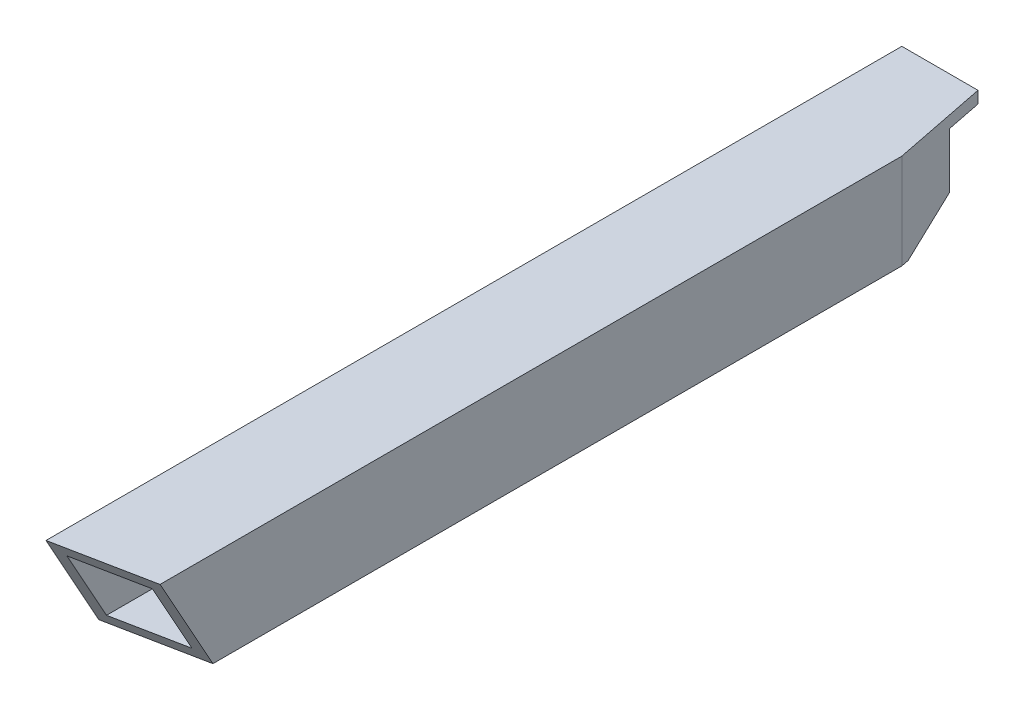
ISO-10303-21;
HEADER;
FILE_DESCRIPTION(('STEP AP214'),'2;1');
FILE_NAME('part.step','',(''),(''),'','','');
FILE_SCHEMA(('AUTOMOTIVE_DESIGN { 1 0 10303 214 1 1 1 1 }'));
ENDSEC;
DATA;
#1=APPLICATION_CONTEXT('core data for automotive mechanical design processes');
#2=APPLICATION_PROTOCOL_DEFINITION('international standard','automotive_design',2000,#1);
#3=PRODUCT_CONTEXT('',#1,'mechanical');
#4=PRODUCT('Part','Part','',(#3));
#5=PRODUCT_RELATED_PRODUCT_CATEGORY('part','',(#4));
#6=PRODUCT_DEFINITION_FORMATION('','',#4);
#7=PRODUCT_DEFINITION_CONTEXT('part definition',#1,'design');
#8=PRODUCT_DEFINITION('design','',#6,#7);
#9=PRODUCT_DEFINITION_SHAPE('','',#8);
#10=(LENGTH_UNIT() NAMED_UNIT(*) SI_UNIT(.MILLI.,.METRE.));
#11=(NAMED_UNIT(*) PLANE_ANGLE_UNIT() SI_UNIT($,.RADIAN.));
#12=(NAMED_UNIT(*) SI_UNIT($,.STERADIAN.) SOLID_ANGLE_UNIT());
#13=UNCERTAINTY_MEASURE_WITH_UNIT(LENGTH_MEASURE(1.E-05),#10,'distance_accuracy_value','');
#14=(GEOMETRIC_REPRESENTATION_CONTEXT(3) GLOBAL_UNCERTAINTY_ASSIGNED_CONTEXT((#13)) GLOBAL_UNIT_ASSIGNED_CONTEXT((#10,
#11,#12)) REPRESENTATION_CONTEXT('',''));
#15=CARTESIAN_POINT('',(0.,0.,0.));
#16=DIRECTION('',(0.,0.,1.));
#17=DIRECTION('',(1.,0.,0.));
#18=AXIS2_PLACEMENT_3D('',#15,#16,#17);
#19=CARTESIAN_POINT('',(12.7,-12.7,114.3));
#20=DIRECTION('',(0.,1.,0.));
#21=DIRECTION('',(0.,0.,1.));
#22=AXIS2_PLACEMENT_3D('',#19,#20,#21);
#23=PLANE('',#22);
#24=DIRECTION('',(-0.999378196944264,0.,-0.0352593175264528));
#25=VECTOR('',#24,1.);
#26=CARTESIAN_POINT('',(19.9342979692048,-12.7,-90.746500267549));
#27=LINE('',#26,#25);
#28=CARTESIAN_POINT('',(12.2785974410021,-12.7,-91.016602994061));
#29=VERTEX_POINT('',#28);
#30=CARTESIAN_POINT('',(-12.7,-12.7,-91.8978792728819));
#31=VERTEX_POINT('',#30);
#32=EDGE_CURVE('E122',#29,#31,#27,.T.);
#33=ORIENTED_EDGE('',*,*,#32,.F.);
#34=DIRECTION('',(-0.195261498367845,0.,-0.98075121578061));
#35=VECTOR('',#34,1.);
#36=CARTESIAN_POINT('',(51.6133998300237,-12.7,106.552582882245));
#37=LINE('',#36,#35);
#38=CARTESIAN_POINT('',(12.7,-12.7,-88.9));
#39=VERTEX_POINT('',#38);
#40=EDGE_CURVE('E62',#39,#29,#37,.T.);
#41=ORIENTED_EDGE('',*,*,#40,.F.);
#42=DIRECTION('',(0.,0.,-1.));
#43=VECTOR('',#42,1.);
#44=CARTESIAN_POINT('',(12.7,-12.7,114.3));
#45=LINE('',#44,#43);
#46=CARTESIAN_POINT('',(12.7,-12.7,95.1168240755557));
#47=VERTEX_POINT('',#46);
#48=EDGE_CURVE('E191',#47,#39,#45,.T.);
#49=ORIENTED_EDGE('',*,*,#48,.F.);
#50=DIRECTION('',(0.98075121578061,0.,-0.195261498367845));
#51=VECTOR('',#50,1.);
#52=CARTESIAN_POINT('',(9.0263651832796,-12.7,95.8482220358408));
#53=LINE('',#52,#51);
#54=CARTESIAN_POINT('',(-12.7,-12.7,100.173806905392));
#55=VERTEX_POINT('',#54);
#56=EDGE_CURVE('E157',#55,#47,#53,.T.);
#57=ORIENTED_EDGE('',*,*,#56,.F.);
#58=DIRECTION('',(0.,0.,-1.));
#59=VECTOR('',#58,1.);
#60=CARTESIAN_POINT('',(-12.7,-12.7,114.3));
#61=LINE('',#60,#59);
#62=EDGE_CURVE('E129',#55,#31,#61,.T.);
#63=ORIENTED_EDGE('',*,*,#62,.T.);
#64=EDGE_LOOP('',(#33,#41,#49,#57,#63));
#65=FACE_BOUND('',#64,.T.);
#66=ADVANCED_FACE('F40',(#65),#23,.F.);
#67=CARTESIAN_POINT('',(9.525,-9.525,114.3));
#68=DIRECTION('',(0.,1.,0.));
#69=DIRECTION('',(0.,0.,1.));
#70=AXIS2_PLACEMENT_3D('',#67,#68,#69);
#71=PLANE('',#70);
#72=DIRECTION('',(0.,0.,-1.));
#73=VECTOR('',#72,1.);
#74=CARTESIAN_POINT('',(9.525,-9.525,114.3));
#75=LINE('',#74,#73);
#76=CARTESIAN_POINT('',(9.525,-9.525,97.5147210661112));
#77=VERTEX_POINT('',#76);
#78=CARTESIAN_POINT('',(9.525,-9.52499999999999,-96.9383195232982));
#79=VERTEX_POINT('',#78);
#80=EDGE_CURVE('E179',#77,#79,#75,.T.);
#81=ORIENTED_EDGE('',*,*,#80,.T.);
#82=DIRECTION('',(-0.999378196944264,0.,-0.0352593175264528));
#83=VECTOR('',#82,1.);
#84=CARTESIAN_POINT('',(16.9684877186839,-9.525,-96.6757039311432));
#85=LINE('',#84,#83);
#86=CARTESIAN_POINT('',(-9.52499999999999,-9.525,-97.6104274409341));
#87=VERTEX_POINT('',#86);
#88=EDGE_CURVE('E131',#79,#87,#85,.T.);
#89=ORIENTED_EDGE('',*,*,#88,.T.);
#90=DIRECTION('',(0.,0.,-1.));
#91=VECTOR('',#90,1.);
#92=CARTESIAN_POINT('',(-9.52499999999999,-9.525,114.3));
#93=LINE('',#92,#91);
#94=CARTESIAN_POINT('',(-9.525,-9.525,101.307458188488));
#95=VERTEX_POINT('',#94);
#96=EDGE_CURVE('E182',#95,#87,#93,.T.);
#97=ORIENTED_EDGE('',*,*,#96,.F.);
#98=DIRECTION('',(0.98075121578061,0.,-0.195261498367845));
#99=VECTOR('',#98,1.);
#100=CARTESIAN_POINT('',(6.31056953536965,-9.525,98.1546942813607));
#101=LINE('',#100,#99);
#102=EDGE_CURVE('E140',#95,#77,#101,.T.);
#103=ORIENTED_EDGE('',*,*,#102,.T.);
#104=EDGE_LOOP('',(#81,#89,#97,#103));
#105=FACE_BOUND('',#104,.T.);
#106=ADVANCED_FACE('F233',(#105),#71,.T.);
#107=CARTESIAN_POINT('',(9.525,-9.525,114.3));
#108=DIRECTION('',(-1.,0.,0.));
#109=DIRECTION('',(0.,0.,1.));
#110=AXIS2_PLACEMENT_3D('',#107,#108,#109);
#111=PLANE('',#110);
#112=DIRECTION('',(0.,-1.,0.));
#113=VECTOR('',#112,1.);
#114=CARTESIAN_POINT('',(9.525,-9.525,-104.847256044493));
#115=LINE('',#114,#113);
#116=CARTESIAN_POINT('',(9.525,9.525,-104.847256044493));
#117=VERTEX_POINT('',#116);
#118=CARTESIAN_POINT('',(9.52499999999999,-5.21379933896032,-104.847256044493));
#119=VERTEX_POINT('',#118);
#120=EDGE_CURVE('E221',#117,#119,#115,.T.);
#121=ORIENTED_EDGE('',*,*,#120,.T.);
#122=DIRECTION('',(0.,-0.478615562436227,0.878024568787146));
#123=VECTOR('',#122,1.);
#124=CARTESIAN_POINT('',(9.525,-98.2949935119247,65.9110347221163));
#125=LINE('',#124,#123);
#126=EDGE_CURVE('E55',#119,#79,#125,.T.);
#127=ORIENTED_EDGE('',*,*,#126,.T.);
#128=ORIENTED_EDGE('',*,*,#80,.F.);
#129=DIRECTION('',(0.,0.873936887721125,0.486039418442901));
#130=VECTOR('',#129,1.);
#131=CARTESIAN_POINT('',(9.525,-2.39515438657077,101.479979958633));
#132=LINE('',#131,#130);
#133=CARTESIAN_POINT('',(9.525,9.525,108.109365887067));
#134=VERTEX_POINT('',#133);
#135=EDGE_CURVE('E137',#77,#134,#132,.T.);
#136=ORIENTED_EDGE('',*,*,#135,.T.);
#137=DIRECTION('',(0.,0.,-1.));
#138=VECTOR('',#137,1.);
#139=CARTESIAN_POINT('',(9.525,9.525,114.3));
#140=LINE('',#139,#138);
#141=EDGE_CURVE('E176',#134,#117,#140,.T.);
#142=ORIENTED_EDGE('',*,*,#141,.T.);
#143=EDGE_LOOP('',(#121,#127,#128,#136,#142));
#144=FACE_BOUND('',#143,.T.);
#145=ADVANCED_FACE('F231',(#144),#111,.T.);
#146=CARTESIAN_POINT('',(0.,0.,-114.3));
#147=DIRECTION('',(0.,0.,1.));
#148=DIRECTION('',(1.,0.,0.));
#149=AXIS2_PLACEMENT_3D('',#146,#147,#148);
#150=PLANE('',#149);
#151=DIRECTION('',(0.999815116604603,0.0192284323054417,0.));
#152=VECTOR('',#151,1.);
#153=CARTESIAN_POINT('',(0.00469560413334707,-0.244155941552387,-114.3));
#154=LINE('',#153,#152);
#155=CARTESIAN_POINT('',(-12.7,-0.488492494709308,-114.3));
#156=VERTEX_POINT('',#155);
#157=CARTESIAN_POINT('',(-9.52499999999999,-0.427430932870621,-114.3));
#158=VERTEX_POINT('',#157);
#159=EDGE_CURVE('E213',#156,#158,#154,.T.);
#160=ORIENTED_EDGE('',*,*,#159,.F.);
#161=DIRECTION('',(0.,-1.,0.));
#162=VECTOR('',#161,1.);
#163=CARTESIAN_POINT('',(-12.7,-12.7,-114.3));
#164=LINE('',#163,#162);
#165=CARTESIAN_POINT('',(-12.7,12.7,-114.3));
#166=VERTEX_POINT('',#165);
#167=EDGE_CURVE('E168',#166,#156,#164,.T.);
#168=ORIENTED_EDGE('',*,*,#167,.F.);
#169=DIRECTION('',(-1.,0.,0.));
#170=VECTOR('',#169,1.);
#171=CARTESIAN_POINT('',(12.7,12.7,-114.3));
#172=LINE('',#171,#170);
#173=CARTESIAN_POINT('',(7.64301717016405,12.7,-114.3));
#174=VERTEX_POINT('',#173);
#175=EDGE_CURVE('E171',#174,#166,#172,.T.);
#176=ORIENTED_EDGE('',*,*,#175,.F.);
#177=DIRECTION('',(0.,1.,0.));
#178=VECTOR('',#177,1.);
#179=CARTESIAN_POINT('',(7.64301717016405,0.,-114.3));
#180=LINE('',#179,#178);
#181=CARTESIAN_POINT('',(7.64301717016405,9.525,-114.3));
#182=VERTEX_POINT('',#181);
#183=EDGE_CURVE('E48',#182,#174,#180,.T.);
#184=ORIENTED_EDGE('',*,*,#183,.F.);
#185=DIRECTION('',(-1.,0.,0.));
#186=VECTOR('',#185,1.);
#187=CARTESIAN_POINT('',(9.525,9.525,-114.3));
#188=LINE('',#187,#186);
#189=CARTESIAN_POINT('',(-9.52499999999999,9.525,-114.3));
#190=VERTEX_POINT('',#189);
#191=EDGE_CURVE('E166',#182,#190,#188,.T.);
#192=ORIENTED_EDGE('',*,*,#191,.T.);
#193=DIRECTION('',(0.,-1.,0.));
#194=VECTOR('',#193,1.);
#195=CARTESIAN_POINT('',(-9.52499999999999,-9.525,-114.3));
#196=LINE('',#195,#194);
#197=EDGE_CURVE('E163',#190,#158,#196,.T.);
#198=ORIENTED_EDGE('',*,*,#197,.T.);
#199=EDGE_LOOP('',(#160,#168,#176,#184,#192,#198));
#200=FACE_BOUND('',#199,.T.);
#201=ADVANCED_FACE('F203',(#200),#150,.F.);
#202=CARTESIAN_POINT('',(-12.7,-12.7,114.3));
#203=DIRECTION('',(1.,0.,0.));
#204=DIRECTION('',(0.,0.,-1.));
#205=AXIS2_PLACEMENT_3D('',#202,#203,#204);
#206=PLANE('',#205);
#207=DIRECTION('',(0.,0.478615562436227,-0.878024568787146));
#208=VECTOR('',#207,1.);
#209=CARTESIAN_POINT('',(-12.7,-99.3518179397253,67.0656627688317));
#210=LINE('',#209,#208);
#211=EDGE_CURVE('E214',#31,#156,#210,.T.);
#212=ORIENTED_EDGE('',*,*,#211,.F.);
#213=ORIENTED_EDGE('',*,*,#62,.F.);
#214=DIRECTION('',(0.,-0.873936887721125,-0.486039418442901));
#215=VECTOR('',#214,1.);
#216=CARTESIAN_POINT('',(-12.7,-6.69964836648003,103.51089847274));
#217=LINE('',#216,#215);
#218=CARTESIAN_POINT('',(-12.7,12.7,114.3));
#219=VERTEX_POINT('',#218);
#220=EDGE_CURVE('E160',#219,#55,#217,.T.);
#221=ORIENTED_EDGE('',*,*,#220,.F.);
#222=DIRECTION('',(0.,0.,-1.));
#223=VECTOR('',#222,1.);
#224=CARTESIAN_POINT('',(-12.7,12.7,114.3));
#225=LINE('',#224,#223);
#226=EDGE_CURVE('E185',#219,#166,#225,.T.);
#227=ORIENTED_EDGE('',*,*,#226,.T.);
#228=ORIENTED_EDGE('',*,*,#167,.T.);
#229=EDGE_LOOP('',(#212,#213,#221,#227,#228));
#230=FACE_BOUND('',#229,.T.);
#231=ADVANCED_FACE('F42',(#230),#206,.F.);
#232=CARTESIAN_POINT('',(-9.52499999999999,-9.525,114.3));
#233=DIRECTION('',(1.,0.,0.));
#234=DIRECTION('',(0.,0.,-1.));
#235=AXIS2_PLACEMENT_3D('',#232,#233,#234);
#236=PLANE('',#235);
#237=ORIENTED_EDGE('',*,*,#96,.T.);
#238=DIRECTION('',(0.,0.478615562436227,-0.878024568787146));
#239=VECTOR('',#238,1.);
#240=CARTESIAN_POINT('',(-9.52499999999999,-98.5774376045613,65.7570730414758));
#241=LINE('',#240,#239);
#242=EDGE_CURVE('E130',#87,#158,#241,.T.);
#243=ORIENTED_EDGE('',*,*,#242,.T.);
#244=ORIENTED_EDGE('',*,*,#197,.F.);
#245=DIRECTION('',(0.,0.,-1.));
#246=VECTOR('',#245,1.);
#247=CARTESIAN_POINT('',(-9.52499999999999,9.525,114.3));
#248=LINE('',#247,#246);
#249=CARTESIAN_POINT('',(-9.52499999999999,9.525,111.902103009444));
#250=VERTEX_POINT('',#249);
#251=EDGE_CURVE('E173',#250,#190,#248,.T.);
#252=ORIENTED_EDGE('',*,*,#251,.F.);
#253=DIRECTION('',(0.,-0.873936887721125,-0.486039418442901));
#254=VECTOR('',#253,1.);
#255=CARTESIAN_POINT('',(-9.52499999999999,-4.00618690151299,104.376742420074));
#256=LINE('',#255,#254);
#257=EDGE_CURVE('E148',#250,#95,#256,.T.);
#258=ORIENTED_EDGE('',*,*,#257,.T.);
#259=EDGE_LOOP('',(#237,#243,#244,#252,#258));
#260=FACE_BOUND('',#259,.T.);
#261=ADVANCED_FACE('F212',(#260),#236,.T.);
#262=CARTESIAN_POINT('',(29.2403988557757,0.,-5.82158247839419));
#263=DIRECTION('',(0.98075121578061,0.,-0.195261498367845));
#264=DIRECTION('',(-0.195261498367845,0.,-0.98075121578061));
#265=AXIS2_PLACEMENT_3D('',#262,#263,#264);
#266=PLANE('',#265);
#267=ORIENTED_EDGE('',*,*,#40,.T.);
#268=DIRECTION('',(-0.17246656544568,0.46888455698768,-0.86625778843358));
#269=VECTOR('',#268,1.);
#270=CARTESIAN_POINT('',(24.4842908006449,-45.8835976954391,-29.7103613541257));
#271=LINE('',#270,#269);
#272=EDGE_CURVE('E12',#29,#119,#271,.T.);
#273=ORIENTED_EDGE('',*,*,#272,.T.);
#274=ORIENTED_EDGE('',*,*,#120,.F.);
#275=DIRECTION('',(0.195261498367845,0.,0.98075121578061));
#276=VECTOR('',#275,1.);
#277=CARTESIAN_POINT('',(51.4923464375588,9.525,105.944561009901));
#278=LINE('',#277,#276);
#279=EDGE_CURVE('E199',#182,#117,#278,.T.);
#280=ORIENTED_EDGE('',*,*,#279,.F.);
#281=ORIENTED_EDGE('',*,*,#183,.T.);
#282=DIRECTION('',(0.195261498367845,0.,0.98075121578061));
#283=VECTOR('',#282,1.);
#284=CARTESIAN_POINT('',(51.6133998300237,12.7,106.552582882245));
#285=LINE('',#284,#283);
#286=CARTESIAN_POINT('',(12.7,12.7,-88.9));
#287=VERTEX_POINT('',#286);
#288=EDGE_CURVE('E142',#174,#287,#285,.T.);
#289=ORIENTED_EDGE('',*,*,#288,.T.);
#290=DIRECTION('',(0.,-1.,0.));
#291=VECTOR('',#290,1.);
#292=CARTESIAN_POINT('',(12.7,-12.7,-88.9));
#293=LINE('',#292,#291);
#294=EDGE_CURVE('E136',#287,#39,#293,.T.);
#295=ORIENTED_EDGE('',*,*,#294,.T.);
#296=EDGE_LOOP('',(#267,#273,#274,#280,#281,#289,#295));
#297=FACE_BOUND('',#296,.T.);
#298=ADVANCED_FACE('F134',(#297),#266,.T.);
#299=CARTESIAN_POINT('',(12.7,-12.7,114.3));
#300=DIRECTION('',(-1.,0.,0.));
#301=DIRECTION('',(0.,0.,1.));
#302=AXIS2_PLACEMENT_3D('',#299,#300,#301);
#303=PLANE('',#302);
#304=ORIENTED_EDGE('',*,*,#294,.F.);
#305=DIRECTION('',(0.,0.,-1.));
#306=VECTOR('',#305,1.);
#307=CARTESIAN_POINT('',(12.7,12.7,114.3));
#308=LINE('',#307,#306);
#309=CARTESIAN_POINT('',(12.7,12.7,109.243017170164));
#310=VERTEX_POINT('',#309);
#311=EDGE_CURVE('E188',#310,#287,#308,.T.);
#312=ORIENTED_EDGE('',*,*,#311,.F.);
#313=DIRECTION('',(0.,0.873936887721125,0.486039418442901));
#314=VECTOR('',#313,1.);
#315=CARTESIAN_POINT('',(12.7,-4.55160501322373,99.6485485241517));
#316=LINE('',#315,#314);
#317=EDGE_CURVE('E154',#47,#310,#316,.T.);
#318=ORIENTED_EDGE('',*,*,#317,.F.);
#319=ORIENTED_EDGE('',*,*,#48,.T.);
#320=EDGE_LOOP('',(#304,#312,#318,#319));
#321=FACE_BOUND('',#320,.T.);
#322=ADVANCED_FACE('F241',(#321),#303,.F.);
#323=CARTESIAN_POINT('',(12.7,12.7,114.3));
#324=DIRECTION('',(0.,-1.,0.));
#325=DIRECTION('',(0.,0.,-1.));
#326=AXIS2_PLACEMENT_3D('',#323,#324,#325);
#327=PLANE('',#326);
#328=ORIENTED_EDGE('',*,*,#288,.F.);
#329=ORIENTED_EDGE('',*,*,#175,.T.);
#330=ORIENTED_EDGE('',*,*,#226,.F.);
#331=DIRECTION('',(-0.98075121578061,0.,0.195261498367845));
#332=VECTOR('',#331,1.);
#333=CARTESIAN_POINT('',(11.7315728602807,12.7,109.435825021247));
#334=LINE('',#333,#332);
#335=EDGE_CURVE('E151',#310,#219,#334,.T.);
#336=ORIENTED_EDGE('',*,*,#335,.F.);
#337=ORIENTED_EDGE('',*,*,#311,.T.);
#338=EDGE_LOOP('',(#328,#329,#330,#336,#337));
#339=FACE_BOUND('',#338,.T.);
#340=ADVANCED_FACE('F219',(#339),#327,.F.);
#341=CARTESIAN_POINT('',(9.525,9.525,114.3));
#342=DIRECTION('',(0.,-1.,0.));
#343=DIRECTION('',(0.,0.,-1.));
#344=AXIS2_PLACEMENT_3D('',#341,#342,#343);
#345=PLANE('',#344);
#346=ORIENTED_EDGE('',*,*,#191,.F.);
#347=ORIENTED_EDGE('',*,*,#279,.T.);
#348=ORIENTED_EDGE('',*,*,#141,.F.);
#349=DIRECTION('',(-0.98075121578061,0.,0.195261498367845));
#350=VECTOR('',#349,1.);
#351=CARTESIAN_POINT('',(8.33947529312044,9.525,108.345396520415));
#352=LINE('',#351,#350);
#353=EDGE_CURVE('E194',#134,#250,#352,.T.);
#354=ORIENTED_EDGE('',*,*,#353,.T.);
#355=ORIENTED_EDGE('',*,*,#251,.T.);
#356=EDGE_LOOP('',(#346,#347,#348,#354,#355));
#357=FACE_BOUND('',#356,.T.);
#358=ADVANCED_FACE('F206',(#357),#345,.T.);
#359=CARTESIAN_POINT('',(15.4542013014831,-43.1698186554413,77.6227102733519));
#360=DIRECTION('',(0.171419955104357,-0.478845087585913,0.861000918168419));
#361=DIRECTION('',(0.,-0.873936887721125,-0.486039418442901));
#362=AXIS2_PLACEMENT_3D('',#359,#360,#361);
#363=PLANE('',#362);
#364=ORIENTED_EDGE('',*,*,#257,.F.);
#365=ORIENTED_EDGE('',*,*,#353,.F.);
#366=ORIENTED_EDGE('',*,*,#135,.F.);
#367=ORIENTED_EDGE('',*,*,#102,.F.);
#368=EDGE_LOOP('',(#364,#365,#366,#367));
#369=FACE_BOUND('',#368,.T.);
#370=ORIENTED_EDGE('',*,*,#335,.T.);
#371=ORIENTED_EDGE('',*,*,#220,.T.);
#372=ORIENTED_EDGE('',*,*,#56,.T.);
#373=ORIENTED_EDGE('',*,*,#317,.T.);
#374=EDGE_LOOP('',(#370,#371,#372,#373));
#375=FACE_BOUND('',#374,.T.);
#376=ADVANCED_FACE('F236',(#369,#375),#363,.T.);
#377=CARTESIAN_POINT('',(0.92712702827786,-48.2075503171716,-26.2781756102763));
#378=DIRECTION('',(0.0168837509891738,-0.877899414565723,-0.478547340247228));
#379=DIRECTION('',(0.,0.478615562436227,-0.878024568787146));
#380=AXIS2_PLACEMENT_3D('',#377,#378,#379);
#381=PLANE('',#380);
#382=ORIENTED_EDGE('',*,*,#211,.T.);
#383=ORIENTED_EDGE('',*,*,#159,.T.);
#384=ORIENTED_EDGE('',*,*,#242,.F.);
#385=ORIENTED_EDGE('',*,*,#88,.F.);
#386=ORIENTED_EDGE('',*,*,#126,.F.);
#387=ORIENTED_EDGE('',*,*,#272,.F.);
#388=ORIENTED_EDGE('',*,*,#32,.T.);
#389=EDGE_LOOP('',(#382,#383,#384,#385,#386,#387,#388));
#390=FACE_BOUND('',#389,.T.);
#391=ADVANCED_FACE('F121',(#390),#381,.T.);
#392=CLOSED_SHELL('',(#66,#106,#145,#201,#231,#261,#298,#322,#340,#358,#376,#391));
#393=MANIFOLD_SOLID_BREP('B2',#392);
#394=ADVANCED_BREP_SHAPE_REPRESENTATION('',(#18,#393),#14);
#395=SHAPE_DEFINITION_REPRESENTATION(#9,#394);
ENDSEC;
END-ISO-10303-21;
